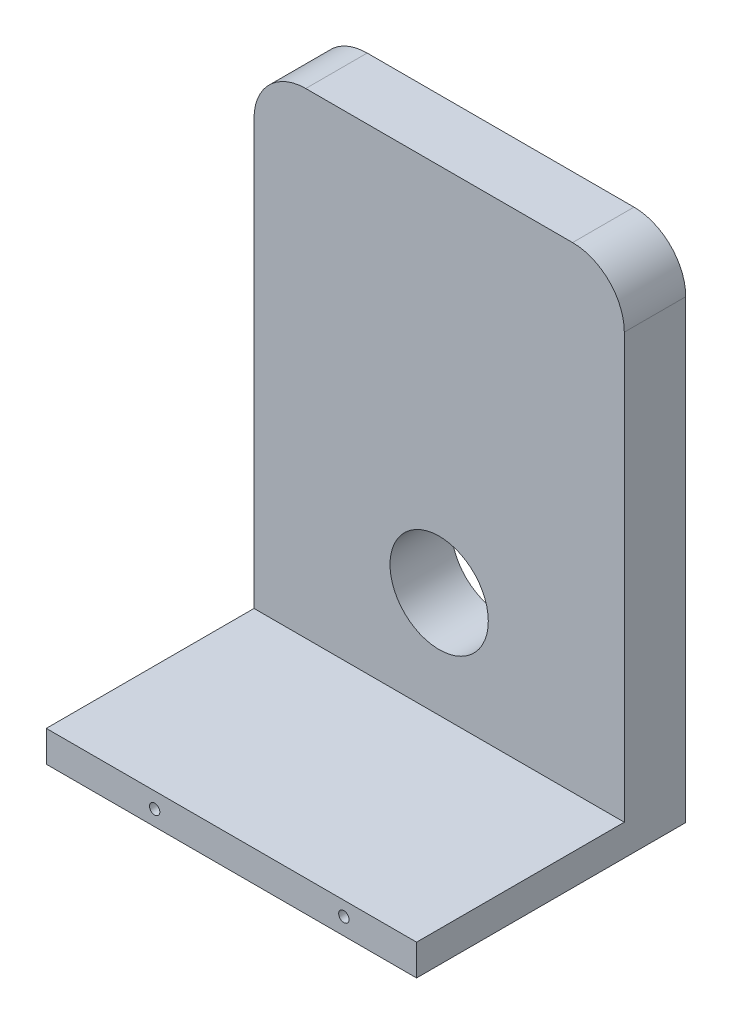
ISO-10303-21;
HEADER;
FILE_DESCRIPTION(('STEP AP214'),'2;1');
FILE_NAME('part.step','',(''),(''),'','','');
FILE_SCHEMA(('AUTOMOTIVE_DESIGN { 1 0 10303 214 1 1 1 1 }'));
ENDSEC;
DATA;
#1=APPLICATION_CONTEXT('core data for automotive mechanical design processes');
#2=APPLICATION_PROTOCOL_DEFINITION('international standard','automotive_design',2000,#1);
#3=PRODUCT_CONTEXT('',#1,'mechanical');
#4=PRODUCT('Part','Part','',(#3));
#5=PRODUCT_RELATED_PRODUCT_CATEGORY('part','',(#4));
#6=PRODUCT_DEFINITION_FORMATION('','',#4);
#7=PRODUCT_DEFINITION_CONTEXT('part definition',#1,'design');
#8=PRODUCT_DEFINITION('design','',#6,#7);
#9=PRODUCT_DEFINITION_SHAPE('','',#8);
#10=(LENGTH_UNIT() NAMED_UNIT(*) SI_UNIT(.MILLI.,.METRE.));
#11=(NAMED_UNIT(*) PLANE_ANGLE_UNIT() SI_UNIT($,.RADIAN.));
#12=(NAMED_UNIT(*) SI_UNIT($,.STERADIAN.) SOLID_ANGLE_UNIT());
#13=UNCERTAINTY_MEASURE_WITH_UNIT(LENGTH_MEASURE(1.E-05),#10,'distance_accuracy_value','');
#14=(GEOMETRIC_REPRESENTATION_CONTEXT(3) GLOBAL_UNCERTAINTY_ASSIGNED_CONTEXT((#13)) GLOBAL_UNIT_ASSIGNED_CONTEXT((#10,
#11,#12)) REPRESENTATION_CONTEXT('',''));
#15=CARTESIAN_POINT('',(0.,0.,0.));
#16=DIRECTION('',(0.,0.,1.));
#17=DIRECTION('',(1.,0.,0.));
#18=AXIS2_PLACEMENT_3D('',#15,#16,#17);
#19=CARTESIAN_POINT('',(0.,0.,7.30012466066358));
#20=DIRECTION('',(0.,0.,1.));
#21=DIRECTION('',(1.,0.,0.));
#22=AXIS2_PLACEMENT_3D('',#19,#20,#21);
#23=PLANE('',#22);
#24=CARTESIAN_POINT('',(0.,-22.5159631074849,7.30012466066358));
#25=DIRECTION('',(0.,0.,1.));
#26=DIRECTION('',(1.,0.,0.));
#27=AXIS2_PLACEMENT_3D('',#24,#25,#26);
#28=CIRCLE('',#27,9.5);
#29=CARTESIAN_POINT('',(9.5,-22.5159631074849,7.30012466066358));
#30=VERTEX_POINT('',#29);
#31=EDGE_CURVE('E124',#30,#30,#28,.F.);
#32=ORIENTED_EDGE('',*,*,#31,.T.);
#33=EDGE_LOOP('',(#32));
#34=FACE_BOUND('',#33,.T.);
#35=DIRECTION('',(0.,1.,0.));
#36=VECTOR('',#35,1.);
#37=CARTESIAN_POINT('',(35.7872230642717,-49.0159631074849,7.30012466066358));
#38=LINE('',#37,#36);
#39=CARTESIAN_POINT('',(35.7872230642717,-43.0159631074849,7.30012466066358));
#40=VERTEX_POINT('',#39);
#41=CARTESIAN_POINT('',(35.7872230642717,39.0159631074849,7.30012466066358));
#42=VERTEX_POINT('',#41);
#43=EDGE_CURVE('E139',#40,#42,#38,.T.);
#44=ORIENTED_EDGE('',*,*,#43,.T.);
#45=CARTESIAN_POINT('',(25.7872230642717,39.0159631074849,7.30012466066358));
#46=DIRECTION('',(0.,0.,1.));
#47=DIRECTION('',(1.,0.,0.));
#48=AXIS2_PLACEMENT_3D('',#45,#46,#47);
#49=CIRCLE('',#48,10.);
#50=CARTESIAN_POINT('',(25.7872230642717,49.0159631074849,7.30012466066358));
#51=VERTEX_POINT('',#50);
#52=EDGE_CURVE('E57',#42,#51,#49,.T.);
#53=ORIENTED_EDGE('',*,*,#52,.T.);
#54=DIRECTION('',(-1.,0.,0.));
#55=VECTOR('',#54,1.);
#56=CARTESIAN_POINT('',(35.7872230642717,49.0159631074849,7.30012466066358));
#57=LINE('',#56,#55);
#58=CARTESIAN_POINT('',(-25.7872230642717,49.0159631074849,7.30012466066358));
#59=VERTEX_POINT('',#58);
#60=EDGE_CURVE('E141',#51,#59,#57,.T.);
#61=ORIENTED_EDGE('',*,*,#60,.T.);
#62=CARTESIAN_POINT('',(-25.7872230642717,39.0159631074849,7.30012466066358));
#63=DIRECTION('',(0.,0.,1.));
#64=DIRECTION('',(1.,0.,0.));
#65=AXIS2_PLACEMENT_3D('',#62,#63,#64);
#66=CIRCLE('',#65,10.);
#67=CARTESIAN_POINT('',(-35.7872230642717,39.0159631074849,7.30012466066358));
#68=VERTEX_POINT('',#67);
#69=EDGE_CURVE('E159',#59,#68,#66,.T.);
#70=ORIENTED_EDGE('',*,*,#69,.T.);
#71=DIRECTION('',(0.,-1.,0.));
#72=VECTOR('',#71,1.);
#73=CARTESIAN_POINT('',(-35.7872230642717,-49.0159631074849,7.30012466066358));
#74=LINE('',#73,#72);
#75=CARTESIAN_POINT('',(-35.7872230642717,-43.0159631074849,7.30012466066358));
#76=VERTEX_POINT('',#75);
#77=EDGE_CURVE('E137',#68,#76,#74,.T.);
#78=ORIENTED_EDGE('',*,*,#77,.T.);
#79=DIRECTION('',(1.,0.,0.));
#80=VECTOR('',#79,1.);
#81=CARTESIAN_POINT('',(0.,-43.0159631074849,7.30012466066358));
#82=LINE('',#81,#80);
#83=EDGE_CURVE('E150',#76,#40,#82,.T.);
#84=ORIENTED_EDGE('',*,*,#83,.T.);
#85=EDGE_LOOP('',(#44,#53,#61,#70,#78,#84));
#86=FACE_BOUND('',#85,.T.);
#87=ADVANCED_FACE('F33',(#34,#86),#23,.T.);
#88=CARTESIAN_POINT('',(-35.7872230642717,-49.0159631074849,-4.572));
#89=DIRECTION('',(-1.,0.,0.));
#90=DIRECTION('',(0.,0.,1.));
#91=AXIS2_PLACEMENT_3D('',#88,#89,#90);
#92=PLANE('',#91);
#93=ORIENTED_EDGE('',*,*,#77,.F.);
#94=DIRECTION('',(0.,0.,1.));
#95=VECTOR('',#94,1.);
#96=CARTESIAN_POINT('',(-35.7872230642717,39.0159631074849,-4.572));
#97=LINE('',#96,#95);
#98=CARTESIAN_POINT('',(-35.7872230642717,39.0159631074849,-4.572));
#99=VERTEX_POINT('',#98);
#100=EDGE_CURVE('E161',#68,#99,#97,.F.);
#101=ORIENTED_EDGE('',*,*,#100,.T.);
#102=DIRECTION('',(0.,-1.,0.));
#103=VECTOR('',#102,1.);
#104=CARTESIAN_POINT('',(-35.7872230642717,-49.0159631074849,-4.572));
#105=LINE('',#104,#103);
#106=CARTESIAN_POINT('',(-35.7872230642717,-49.0159631074849,-4.572));
#107=VERTEX_POINT('',#106);
#108=EDGE_CURVE('E106',#99,#107,#105,.T.);
#109=ORIENTED_EDGE('',*,*,#108,.T.);
#110=DIRECTION('',(0.,0.,1.));
#111=VECTOR('',#110,1.);
#112=CARTESIAN_POINT('',(-35.7872230642717,-49.0159631074849,-4.572));
#113=LINE('',#112,#111);
#114=CARTESIAN_POINT('',(-35.7872230642717,-49.0159631074849,47.4522116654748));
#115=VERTEX_POINT('',#114);
#116=EDGE_CURVE('E98',#107,#115,#113,.T.);
#117=ORIENTED_EDGE('',*,*,#116,.T.);
#118=DIRECTION('',(0.,-1.,0.));
#119=VECTOR('',#118,1.);
#120=CARTESIAN_POINT('',(-35.7872230642717,-49.0159631074849,47.4522116654748));
#121=LINE('',#120,#119);
#122=CARTESIAN_POINT('',(-35.7872230642717,-43.0159631074849,47.4522116654748));
#123=VERTEX_POINT('',#122);
#124=EDGE_CURVE('E104',#123,#115,#121,.T.);
#125=ORIENTED_EDGE('',*,*,#124,.F.);
#126=DIRECTION('',(0.,0.,-1.));
#127=VECTOR('',#126,1.);
#128=CARTESIAN_POINT('',(-35.7872230642717,-43.0159631074849,47.4522116654748));
#129=LINE('',#128,#127);
#130=EDGE_CURVE('E133',#123,#76,#129,.T.);
#131=ORIENTED_EDGE('',*,*,#130,.T.);
#132=EDGE_LOOP('',(#93,#101,#109,#117,#125,#131));
#133=FACE_BOUND('',#132,.T.);
#134=ADVANCED_FACE('F101',(#133),#92,.T.);
#135=CARTESIAN_POINT('',(35.7872230642717,49.0159631074849,-4.572));
#136=DIRECTION('',(0.,1.,0.));
#137=DIRECTION('',(0.,0.,1.));
#138=AXIS2_PLACEMENT_3D('',#135,#136,#137);
#139=PLANE('',#138);
#140=ORIENTED_EDGE('',*,*,#60,.F.);
#141=DIRECTION('',(0.,0.,1.));
#142=VECTOR('',#141,1.);
#143=CARTESIAN_POINT('',(25.7872230642717,49.0159631074849,-4.572));
#144=LINE('',#143,#142);
#145=CARTESIAN_POINT('',(25.7872230642717,49.0159631074849,-4.572));
#146=VERTEX_POINT('',#145);
#147=EDGE_CURVE('E42',#51,#146,#144,.F.);
#148=ORIENTED_EDGE('',*,*,#147,.T.);
#149=DIRECTION('',(-1.,0.,0.));
#150=VECTOR('',#149,1.);
#151=CARTESIAN_POINT('',(35.7872230642717,49.0159631074849,-4.572));
#152=LINE('',#151,#150);
#153=CARTESIAN_POINT('',(-25.7872230642717,49.0159631074849,-4.572));
#154=VERTEX_POINT('',#153);
#155=EDGE_CURVE('E111',#146,#154,#152,.T.);
#156=ORIENTED_EDGE('',*,*,#155,.T.);
#157=DIRECTION('',(0.,0.,1.));
#158=VECTOR('',#157,1.);
#159=CARTESIAN_POINT('',(-25.7872230642717,49.0159631074849,-4.572));
#160=LINE('',#159,#158);
#161=EDGE_CURVE('E154',#154,#59,#160,.T.);
#162=ORIENTED_EDGE('',*,*,#161,.T.);
#163=EDGE_LOOP('',(#140,#148,#156,#162));
#164=FACE_BOUND('',#163,.T.);
#165=ADVANCED_FACE('F204',(#164),#139,.T.);
#166=CARTESIAN_POINT('',(35.7872230642717,-49.0159631074849,-4.572));
#167=DIRECTION('',(1.,0.,0.));
#168=DIRECTION('',(0.,0.,-1.));
#169=AXIS2_PLACEMENT_3D('',#166,#167,#168);
#170=PLANE('',#169);
#171=DIRECTION('',(0.,1.,0.));
#172=VECTOR('',#171,1.);
#173=CARTESIAN_POINT('',(35.7872230642717,-49.0159631074849,-4.572));
#174=LINE('',#173,#172);
#175=CARTESIAN_POINT('',(35.7872230642717,-49.0159631074849,-4.572));
#176=VERTEX_POINT('',#175);
#177=CARTESIAN_POINT('',(35.7872230642717,39.0159631074849,-4.572));
#178=VERTEX_POINT('',#177);
#179=EDGE_CURVE('E146',#176,#178,#174,.T.);
#180=ORIENTED_EDGE('',*,*,#179,.T.);
#181=DIRECTION('',(0.,0.,1.));
#182=VECTOR('',#181,1.);
#183=CARTESIAN_POINT('',(35.7872230642717,39.0159631074849,-4.572));
#184=LINE('',#183,#182);
#185=EDGE_CURVE('E166',#178,#42,#184,.T.);
#186=ORIENTED_EDGE('',*,*,#185,.T.);
#187=ORIENTED_EDGE('',*,*,#43,.F.);
#188=DIRECTION('',(0.,0.,-1.));
#189=VECTOR('',#188,1.);
#190=CARTESIAN_POINT('',(35.7872230642717,-43.0159631074849,47.4522116654748));
#191=LINE('',#190,#189);
#192=CARTESIAN_POINT('',(35.7872230642717,-43.0159631074849,47.4522116654748));
#193=VERTEX_POINT('',#192);
#194=EDGE_CURVE('E135',#193,#40,#191,.T.);
#195=ORIENTED_EDGE('',*,*,#194,.F.);
#196=DIRECTION('',(0.,1.,0.));
#197=VECTOR('',#196,1.);
#198=CARTESIAN_POINT('',(35.7872230642717,-49.0159631074849,47.4522116654748));
#199=LINE('',#198,#197);
#200=CARTESIAN_POINT('',(35.7872230642717,-49.0159631074849,47.4522116654748));
#201=VERTEX_POINT('',#200);
#202=EDGE_CURVE('E118',#201,#193,#199,.T.);
#203=ORIENTED_EDGE('',*,*,#202,.F.);
#204=DIRECTION('',(0.,0.,1.));
#205=VECTOR('',#204,1.);
#206=CARTESIAN_POINT('',(35.7872230642717,-49.0159631074849,-4.572));
#207=LINE('',#206,#205);
#208=EDGE_CURVE('E110',#176,#201,#207,.T.);
#209=ORIENTED_EDGE('',*,*,#208,.F.);
#210=EDGE_LOOP('',(#180,#186,#187,#195,#203,#209));
#211=FACE_BOUND('',#210,.T.);
#212=ADVANCED_FACE('F216',(#211),#170,.T.);
#213=CARTESIAN_POINT('',(35.7872230642717,-49.0159631074849,-4.572));
#214=DIRECTION('',(0.,-1.,0.));
#215=DIRECTION('',(0.,0.,-1.));
#216=AXIS2_PLACEMENT_3D('',#213,#214,#215);
#217=PLANE('',#216);
#218=ORIENTED_EDGE('',*,*,#208,.T.);
#219=DIRECTION('',(1.,0.,0.));
#220=VECTOR('',#219,1.);
#221=CARTESIAN_POINT('',(-35.7872230642717,-49.0159631074849,47.4522116654748));
#222=LINE('',#221,#220);
#223=EDGE_CURVE('E114',#115,#201,#222,.T.);
#224=ORIENTED_EDGE('',*,*,#223,.F.);
#225=ORIENTED_EDGE('',*,*,#116,.F.);
#226=DIRECTION('',(1.,0.,0.));
#227=VECTOR('',#226,1.);
#228=CARTESIAN_POINT('',(35.7872230642717,-49.0159631074849,-4.572));
#229=LINE('',#228,#227);
#230=EDGE_CURVE('E144',#107,#176,#229,.T.);
#231=ORIENTED_EDGE('',*,*,#230,.T.);
#232=EDGE_LOOP('',(#218,#224,#225,#231));
#233=FACE_BOUND('',#232,.T.);
#234=ADVANCED_FACE('F115',(#233),#217,.T.);
#235=CARTESIAN_POINT('',(0.,0.,-4.572));
#236=DIRECTION('',(0.,0.,1.));
#237=DIRECTION('',(1.,0.,0.));
#238=AXIS2_PLACEMENT_3D('',#235,#236,#237);
#239=PLANE('',#238);
#240=CARTESIAN_POINT('',(0.,-22.5159631074849,-4.572));
#241=DIRECTION('',(0.,0.,1.));
#242=DIRECTION('',(1.,0.,0.));
#243=AXIS2_PLACEMENT_3D('',#240,#241,#242);
#244=CIRCLE('',#243,9.5);
#245=CARTESIAN_POINT('',(9.5,-22.5159631074849,-4.572));
#246=VERTEX_POINT('',#245);
#247=EDGE_CURVE('E127',#246,#246,#244,.F.);
#248=ORIENTED_EDGE('',*,*,#247,.F.);
#249=EDGE_LOOP('',(#248));
#250=FACE_BOUND('',#249,.T.);
#251=ORIENTED_EDGE('',*,*,#155,.F.);
#252=CARTESIAN_POINT('',(25.7872230642717,39.0159631074849,-4.572));
#253=DIRECTION('',(0.,0.,1.));
#254=DIRECTION('',(1.,0.,0.));
#255=AXIS2_PLACEMENT_3D('',#252,#253,#254);
#256=CIRCLE('',#255,10.);
#257=EDGE_CURVE('E11',#146,#178,#256,.F.);
#258=ORIENTED_EDGE('',*,*,#257,.T.);
#259=ORIENTED_EDGE('',*,*,#179,.F.);
#260=ORIENTED_EDGE('',*,*,#230,.F.);
#261=ORIENTED_EDGE('',*,*,#108,.F.);
#262=CARTESIAN_POINT('',(-25.7872230642717,39.0159631074849,-4.572));
#263=DIRECTION('',(0.,0.,1.));
#264=DIRECTION('',(1.,0.,0.));
#265=AXIS2_PLACEMENT_3D('',#262,#263,#264);
#266=CIRCLE('',#265,10.);
#267=EDGE_CURVE('E163',#99,#154,#266,.F.);
#268=ORIENTED_EDGE('',*,*,#267,.T.);
#269=EDGE_LOOP('',(#251,#258,#259,#260,#261,#268));
#270=FACE_BOUND('',#269,.T.);
#271=ADVANCED_FACE('F210',(#250,#270),#239,.F.);
#272=CARTESIAN_POINT('',(-35.7872230642717,-43.0159631074849,47.4522116654748));
#273=DIRECTION('',(0.,-1.,0.));
#274=DIRECTION('',(0.,0.,-1.));
#275=AXIS2_PLACEMENT_3D('',#272,#273,#274);
#276=PLANE('',#275);
#277=ORIENTED_EDGE('',*,*,#83,.F.);
#278=ORIENTED_EDGE('',*,*,#130,.F.);
#279=DIRECTION('',(-1.,0.,0.));
#280=VECTOR('',#279,1.);
#281=CARTESIAN_POINT('',(-35.7872230642717,-43.0159631074849,47.4522116654748));
#282=LINE('',#281,#280);
#283=EDGE_CURVE('E122',#193,#123,#282,.T.);
#284=ORIENTED_EDGE('',*,*,#283,.F.);
#285=ORIENTED_EDGE('',*,*,#194,.T.);
#286=EDGE_LOOP('',(#277,#278,#284,#285));
#287=FACE_BOUND('',#286,.T.);
#288=ADVANCED_FACE('F208',(#287),#276,.F.);
#289=CARTESIAN_POINT('',(0.,0.,47.4522116654748));
#290=DIRECTION('',(0.,0.,-1.));
#291=DIRECTION('',(-1.,0.,0.));
#292=AXIS2_PLACEMENT_3D('',#289,#290,#291);
#293=PLANE('',#292);
#294=CARTESIAN_POINT('',(-14.8410132483612,-46.0527586898056,47.4522116654748));
#295=DIRECTION('',(0.,0.,-1.));
#296=DIRECTION('',(-1.,0.,0.));
#297=AXIS2_PLACEMENT_3D('',#294,#295,#296);
#298=CIRCLE('',#297,1.);
#299=CARTESIAN_POINT('',(-15.8410132483612,-46.0527586898056,47.4522116654748));
#300=VERTEX_POINT('',#299);
#301=EDGE_CURVE('E37',#300,#300,#298,.F.);
#302=ORIENTED_EDGE('',*,*,#301,.F.);
#303=EDGE_LOOP('',(#302));
#304=FACE_BOUND('',#303,.T.);
#305=CARTESIAN_POINT('',(21.7293149161328,-45.7660124420176,47.4522116654748));
#306=DIRECTION('',(0.,0.,-1.));
#307=DIRECTION('',(-1.,0.,0.));
#308=AXIS2_PLACEMENT_3D('',#305,#306,#307);
#309=CIRCLE('',#308,1.);
#310=CARTESIAN_POINT('',(20.7293149161328,-45.7660124420176,47.4522116654748));
#311=VERTEX_POINT('',#310);
#312=EDGE_CURVE('E170',#311,#311,#309,.F.);
#313=ORIENTED_EDGE('',*,*,#312,.F.);
#314=EDGE_LOOP('',(#313));
#315=FACE_BOUND('',#314,.T.);
#316=ORIENTED_EDGE('',*,*,#124,.T.);
#317=ORIENTED_EDGE('',*,*,#223,.T.);
#318=ORIENTED_EDGE('',*,*,#202,.T.);
#319=ORIENTED_EDGE('',*,*,#283,.T.);
#320=EDGE_LOOP('',(#316,#317,#318,#319));
#321=FACE_BOUND('',#320,.T.);
#322=ADVANCED_FACE('F120',(#304,#315,#321),#293,.F.);
#323=CARTESIAN_POINT('',(0.,-22.5159631074849,34.));
#324=DIRECTION('',(0.,0.,-1.));
#325=DIRECTION('',(-1.,0.,0.));
#326=AXIS2_PLACEMENT_3D('',#323,#324,#325);
#327=CYLINDRICAL_SURFACE('',#326,9.5);
#328=ORIENTED_EDGE('',*,*,#31,.F.);
#329=EDGE_LOOP('',(#328));
#330=FACE_BOUND('',#329,.T.);
#331=ORIENTED_EDGE('',*,*,#247,.T.);
#332=EDGE_LOOP('',(#331));
#333=FACE_BOUND('',#332,.T.);
#334=ADVANCED_FACE('F222',(#330,#333),#327,.F.);
#335=CARTESIAN_POINT('',(-25.7872230642717,39.0159631074849,-4.572));
#336=DIRECTION('',(0.,0.,1.));
#337=DIRECTION('',(1.,0.,0.));
#338=AXIS2_PLACEMENT_3D('',#335,#336,#337);
#339=CYLINDRICAL_SURFACE('',#338,10.);
#340=ORIENTED_EDGE('',*,*,#267,.F.);
#341=ORIENTED_EDGE('',*,*,#100,.F.);
#342=ORIENTED_EDGE('',*,*,#69,.F.);
#343=ORIENTED_EDGE('',*,*,#161,.F.);
#344=EDGE_LOOP('',(#340,#341,#342,#343));
#345=FACE_BOUND('',#344,.T.);
#346=ADVANCED_FACE('F195',(#345),#339,.T.);
#347=CARTESIAN_POINT('',(25.7872230642717,39.0159631074849,-4.572));
#348=DIRECTION('',(0.,0.,1.));
#349=DIRECTION('',(1.,0.,0.));
#350=AXIS2_PLACEMENT_3D('',#347,#348,#349);
#351=CYLINDRICAL_SURFACE('',#350,10.);
#352=ORIENTED_EDGE('',*,*,#257,.F.);
#353=ORIENTED_EDGE('',*,*,#147,.F.);
#354=ORIENTED_EDGE('',*,*,#52,.F.);
#355=ORIENTED_EDGE('',*,*,#185,.F.);
#356=EDGE_LOOP('',(#352,#353,#354,#355));
#357=FACE_BOUND('',#356,.T.);
#358=ADVANCED_FACE('F35',(#357),#351,.T.);
#359=CARTESIAN_POINT('',(21.7293149161328,-45.7660124420176,69.4522116654748));
#360=DIRECTION('',(0.,0.,-1.));
#361=DIRECTION('',(-1.,0.,0.));
#362=AXIS2_PLACEMENT_3D('',#359,#360,#361);
#363=CYLINDRICAL_SURFACE('',#362,1.);
#364=CARTESIAN_POINT('',(21.7293149161328,-45.7660124420176,23.4522116654748));
#365=DIRECTION('',(0.,0.,1.));
#366=DIRECTION('',(1.,0.,0.));
#367=AXIS2_PLACEMENT_3D('',#364,#365,#366);
#368=CIRCLE('',#367,1.);
#369=CARTESIAN_POINT('',(22.7293149161328,-45.7660124420176,23.4522116654748));
#370=VERTEX_POINT('',#369);
#371=EDGE_CURVE('E177',#370,#370,#368,.T.);
#372=ORIENTED_EDGE('',*,*,#371,.F.);
#373=EDGE_LOOP('',(#372));
#374=FACE_BOUND('',#373,.T.);
#375=ORIENTED_EDGE('',*,*,#312,.T.);
#376=EDGE_LOOP('',(#375));
#377=FACE_BOUND('',#376,.T.);
#378=ADVANCED_FACE('F186',(#374,#377),#363,.F.);
#379=CARTESIAN_POINT('',(21.7293149161328,-45.7660124420176,23.4522116654748));
#380=DIRECTION('',(0.,0.,1.));
#381=DIRECTION('',(1.,0.,0.));
#382=AXIS2_PLACEMENT_3D('',#379,#380,#381);
#383=PLANE('',#382);
#384=ORIENTED_EDGE('',*,*,#371,.T.);
#385=EDGE_LOOP('',(#384));
#386=FACE_BOUND('',#385,.T.);
#387=ADVANCED_FACE('F184',(#386),#383,.T.);
#388=CARTESIAN_POINT('',(-14.8410132483612,-46.0527586898056,69.4522116654748));
#389=DIRECTION('',(0.,0.,-1.));
#390=DIRECTION('',(-1.,0.,0.));
#391=AXIS2_PLACEMENT_3D('',#388,#389,#390);
#392=CYLINDRICAL_SURFACE('',#391,1.);
#393=CARTESIAN_POINT('',(-14.8410132483612,-46.0527586898056,23.4522116654748));
#394=DIRECTION('',(0.,0.,1.));
#395=DIRECTION('',(1.,0.,0.));
#396=AXIS2_PLACEMENT_3D('',#393,#394,#395);
#397=CIRCLE('',#396,1.);
#398=CARTESIAN_POINT('',(-13.8410132483612,-46.0527586898056,23.4522116654748));
#399=VERTEX_POINT('',#398);
#400=EDGE_CURVE('E172',#399,#399,#397,.T.);
#401=ORIENTED_EDGE('',*,*,#400,.F.);
#402=EDGE_LOOP('',(#401));
#403=FACE_BOUND('',#402,.T.);
#404=ORIENTED_EDGE('',*,*,#301,.T.);
#405=EDGE_LOOP('',(#404));
#406=FACE_BOUND('',#405,.T.);
#407=ADVANCED_FACE('F193',(#403,#406),#392,.F.);
#408=CARTESIAN_POINT('',(-14.8410132483612,-46.0527586898056,23.4522116654748));
#409=DIRECTION('',(0.,0.,1.));
#410=DIRECTION('',(1.,0.,0.));
#411=AXIS2_PLACEMENT_3D('',#408,#409,#410);
#412=PLANE('',#411);
#413=ORIENTED_EDGE('',*,*,#400,.T.);
#414=EDGE_LOOP('',(#413));
#415=FACE_BOUND('',#414,.T.);
#416=ADVANCED_FACE('F251',(#415),#412,.T.);
#417=CLOSED_SHELL('',(#87,#134,#165,#212,#234,#271,#288,#322,#334,#346,#358,#378,#387,#407,#416));
#418=MANIFOLD_SOLID_BREP('B2',#417);
#419=ADVANCED_BREP_SHAPE_REPRESENTATION('',(#18,#418),#14);
#420=SHAPE_DEFINITION_REPRESENTATION(#9,#419);
ENDSEC;
END-ISO-10303-21;
